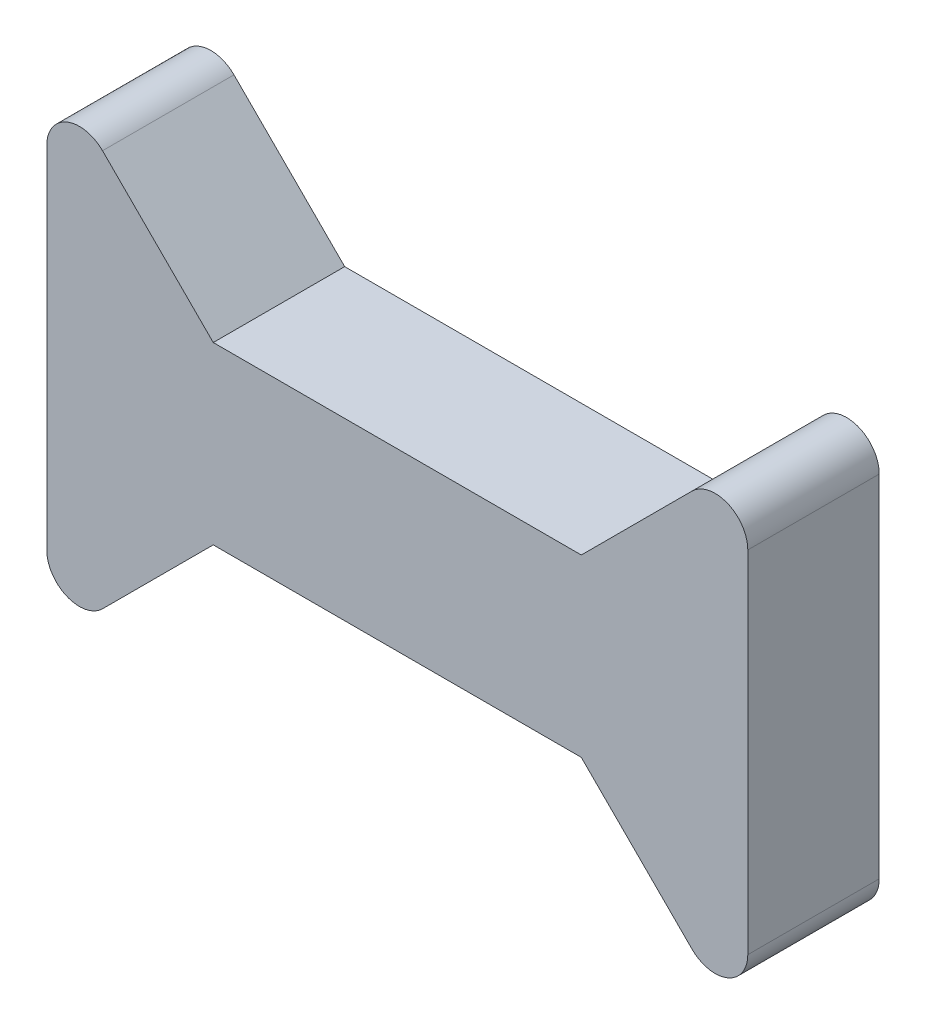
ISO-10303-21;
HEADER;
FILE_DESCRIPTION(('STEP AP214'),'2;1');
FILE_NAME('part.step','',(''),(''),'','','');
FILE_SCHEMA(('AUTOMOTIVE_DESIGN { 1 0 10303 214 1 1 1 1 }'));
ENDSEC;
DATA;
#1=APPLICATION_CONTEXT('core data for automotive mechanical design processes');
#2=APPLICATION_PROTOCOL_DEFINITION('international standard','automotive_design',2000,#1);
#3=PRODUCT_CONTEXT('',#1,'mechanical');
#4=PRODUCT('Part','Part','',(#3));
#5=PRODUCT_RELATED_PRODUCT_CATEGORY('part','',(#4));
#6=PRODUCT_DEFINITION_FORMATION('','',#4);
#7=PRODUCT_DEFINITION_CONTEXT('part definition',#1,'design');
#8=PRODUCT_DEFINITION('design','',#6,#7);
#9=PRODUCT_DEFINITION_SHAPE('','',#8);
#10=(LENGTH_UNIT() NAMED_UNIT(*) SI_UNIT(.MILLI.,.METRE.));
#11=(NAMED_UNIT(*) PLANE_ANGLE_UNIT() SI_UNIT($,.RADIAN.));
#12=(NAMED_UNIT(*) SI_UNIT($,.STERADIAN.) SOLID_ANGLE_UNIT());
#13=UNCERTAINTY_MEASURE_WITH_UNIT(LENGTH_MEASURE(1.E-05),#10,'distance_accuracy_value','');
#14=(GEOMETRIC_REPRESENTATION_CONTEXT(3) GLOBAL_UNCERTAINTY_ASSIGNED_CONTEXT((#13)) GLOBAL_UNIT_ASSIGNED_CONTEXT((#10,
#11,#12)) REPRESENTATION_CONTEXT('',''));
#15=CARTESIAN_POINT('',(0.,0.,0.));
#16=DIRECTION('',(0.,0.,1.));
#17=DIRECTION('',(1.,0.,0.));
#18=AXIS2_PLACEMENT_3D('',#15,#16,#17);
#19=CARTESIAN_POINT('',(10.5,5.,7.5));
#20=DIRECTION('',(0.707106781186549,-0.707106781186546,0.));
#21=DIRECTION('',(0.707106781186546,0.707106781186549,0.));
#22=AXIS2_PLACEMENT_3D('',#19,#20,#21);
#23=PLANE('',#22);
#24=DIRECTION('',(-0.707106781186546,-0.707106781186549,0.));
#25=VECTOR('',#24,1.);
#26=CARTESIAN_POINT('',(10.5,5.,0.));
#27=LINE('',#26,#25);
#28=CARTESIAN_POINT('',(16.8180194846605,11.3180194846605,0.));
#29=VERTEX_POINT('',#28);
#30=CARTESIAN_POINT('',(10.5,5.,0.));
#31=VERTEX_POINT('',#30);
#32=EDGE_CURVE('E159',#29,#31,#27,.T.);
#33=ORIENTED_EDGE('',*,*,#32,.T.);
#34=DIRECTION('',(0.,0.,-1.));
#35=VECTOR('',#34,1.);
#36=CARTESIAN_POINT('',(10.5,5.,7.5));
#37=LINE('',#36,#35);
#38=CARTESIAN_POINT('',(10.5,5.,7.5));
#39=VERTEX_POINT('',#38);
#40=EDGE_CURVE('E11',#39,#31,#37,.T.);
#41=ORIENTED_EDGE('',*,*,#40,.F.);
#42=DIRECTION('',(-0.707106781186546,-0.707106781186549,0.));
#43=VECTOR('',#42,1.);
#44=CARTESIAN_POINT('',(10.5,5.,7.5));
#45=LINE('',#44,#43);
#46=CARTESIAN_POINT('',(16.8180194846605,11.3180194846605,7.5));
#47=VERTEX_POINT('',#46);
#48=EDGE_CURVE('E181',#47,#39,#45,.T.);
#49=ORIENTED_EDGE('',*,*,#48,.F.);
#50=DIRECTION('',(0.,0.,-1.));
#51=VECTOR('',#50,1.);
#52=CARTESIAN_POINT('',(16.8180194846605,11.3180194846605,7.5));
#53=LINE('',#52,#51);
#54=EDGE_CURVE('E155',#47,#29,#53,.T.);
#55=ORIENTED_EDGE('',*,*,#54,.T.);
#56=EDGE_LOOP('',(#33,#41,#49,#55));
#57=FACE_BOUND('',#56,.T.);
#58=ADVANCED_FACE('F39',(#57),#23,.F.);
#59=CARTESIAN_POINT('',(-10.5,5.,7.5));
#60=DIRECTION('',(0.,-1.,0.));
#61=DIRECTION('',(0.,0.,-1.));
#62=AXIS2_PLACEMENT_3D('',#59,#60,#61);
#63=PLANE('',#62);
#64=DIRECTION('',(-1.,0.,0.));
#65=VECTOR('',#64,1.);
#66=CARTESIAN_POINT('',(-10.5,5.,0.));
#67=LINE('',#66,#65);
#68=CARTESIAN_POINT('',(-10.5,5.,0.));
#69=VERTEX_POINT('',#68);
#70=EDGE_CURVE('E162',#31,#69,#67,.T.);
#71=ORIENTED_EDGE('',*,*,#70,.T.);
#72=DIRECTION('',(0.,0.,-1.));
#73=VECTOR('',#72,1.);
#74=CARTESIAN_POINT('',(-10.5,5.,7.5));
#75=LINE('',#74,#73);
#76=CARTESIAN_POINT('',(-10.5,5.,7.5));
#77=VERTEX_POINT('',#76);
#78=EDGE_CURVE('E47',#77,#69,#75,.T.);
#79=ORIENTED_EDGE('',*,*,#78,.F.);
#80=DIRECTION('',(-1.,0.,0.));
#81=VECTOR('',#80,1.);
#82=CARTESIAN_POINT('',(-10.5,5.,7.5));
#83=LINE('',#82,#81);
#84=EDGE_CURVE('E110',#39,#77,#83,.T.);
#85=ORIENTED_EDGE('',*,*,#84,.F.);
#86=ORIENTED_EDGE('',*,*,#40,.T.);
#87=EDGE_LOOP('',(#71,#79,#85,#86));
#88=FACE_BOUND('',#87,.T.);
#89=ADVANCED_FACE('F259',(#88),#63,.F.);
#90=CARTESIAN_POINT('',(-10.5,5.,7.5));
#91=DIRECTION('',(-0.707106781186549,-0.707106781186546,0.));
#92=DIRECTION('',(0.707106781186546,-0.707106781186549,0.));
#93=AXIS2_PLACEMENT_3D('',#90,#91,#92);
#94=PLANE('',#93);
#95=DIRECTION('',(-0.707106781186546,0.707106781186549,0.));
#96=VECTOR('',#95,1.);
#97=CARTESIAN_POINT('',(-10.5,5.,0.));
#98=LINE('',#97,#96);
#99=CARTESIAN_POINT('',(-16.8180194846605,11.3180194846605,0.));
#100=VERTEX_POINT('',#99);
#101=EDGE_CURVE('E164',#69,#100,#98,.T.);
#102=ORIENTED_EDGE('',*,*,#101,.T.);
#103=DIRECTION('',(0.,0.,-1.));
#104=VECTOR('',#103,1.);
#105=CARTESIAN_POINT('',(-16.8180194846605,11.3180194846605,7.5));
#106=LINE('',#105,#104);
#107=CARTESIAN_POINT('',(-16.8180194846605,11.3180194846605,7.5));
#108=VERTEX_POINT('',#107);
#109=EDGE_CURVE('E200',#108,#100,#106,.T.);
#110=ORIENTED_EDGE('',*,*,#109,.F.);
#111=DIRECTION('',(-0.707106781186546,0.707106781186549,0.));
#112=VECTOR('',#111,1.);
#113=CARTESIAN_POINT('',(-10.5,5.,7.5));
#114=LINE('',#113,#112);
#115=EDGE_CURVE('E208',#77,#108,#114,.T.);
#116=ORIENTED_EDGE('',*,*,#115,.F.);
#117=ORIENTED_EDGE('',*,*,#78,.T.);
#118=EDGE_LOOP('',(#102,#110,#116,#117));
#119=FACE_BOUND('',#118,.T.);
#120=ADVANCED_FACE('F206',(#119),#94,.F.);
#121=CARTESIAN_POINT('',(-18.1360389693211,10.,7.5));
#122=DIRECTION('',(0.,0.,-1.));
#123=DIRECTION('',(-1.,0.,0.));
#124=AXIS2_PLACEMENT_3D('',#121,#122,#123);
#125=CYLINDRICAL_SURFACE('',#124,1.86396103067894);
#126=CARTESIAN_POINT('',(-18.1360389693211,10.,0.));
#127=DIRECTION('',(0.,0.,1.));
#128=DIRECTION('',(1.,0.,0.));
#129=AXIS2_PLACEMENT_3D('',#126,#127,#128);
#130=CIRCLE('',#129,1.86396103067894);
#131=CARTESIAN_POINT('',(-20.,9.99999999999999,0.));
#132=VERTEX_POINT('',#131);
#133=EDGE_CURVE('E166',#100,#132,#130,.T.);
#134=ORIENTED_EDGE('',*,*,#133,.T.);
#135=DIRECTION('',(0.,0.,-1.));
#136=VECTOR('',#135,1.);
#137=CARTESIAN_POINT('',(-20.,9.99999999999999,7.5));
#138=LINE('',#137,#136);
#139=CARTESIAN_POINT('',(-20.,9.99999999999999,7.5));
#140=VERTEX_POINT('',#139);
#141=EDGE_CURVE('E197',#140,#132,#138,.T.);
#142=ORIENTED_EDGE('',*,*,#141,.F.);
#143=CARTESIAN_POINT('',(-18.1360389693211,10.,7.5));
#144=DIRECTION('',(0.,0.,1.));
#145=DIRECTION('',(1.,0.,0.));
#146=AXIS2_PLACEMENT_3D('',#143,#144,#145);
#147=CIRCLE('',#146,1.86396103067894);
#148=EDGE_CURVE('E226',#108,#140,#147,.T.);
#149=ORIENTED_EDGE('',*,*,#148,.F.);
#150=ORIENTED_EDGE('',*,*,#109,.T.);
#151=EDGE_LOOP('',(#134,#142,#149,#150));
#152=FACE_BOUND('',#151,.T.);
#153=ADVANCED_FACE('F217',(#152),#125,.T.);
#154=CARTESIAN_POINT('',(-20.,9.99999999999999,7.5));
#155=DIRECTION('',(1.,0.,0.));
#156=DIRECTION('',(0.,1.,0.));
#157=AXIS2_PLACEMENT_3D('',#154,#155,#156);
#158=PLANE('',#157);
#159=DIRECTION('',(0.,-1.,0.));
#160=VECTOR('',#159,1.);
#161=CARTESIAN_POINT('',(-20.,9.99999999999999,0.));
#162=LINE('',#161,#160);
#163=CARTESIAN_POINT('',(-20.,-9.99999999999999,0.));
#164=VERTEX_POINT('',#163);
#165=EDGE_CURVE('E168',#132,#164,#162,.T.);
#166=ORIENTED_EDGE('',*,*,#165,.T.);
#167=DIRECTION('',(0.,0.,-1.));
#168=VECTOR('',#167,1.);
#169=CARTESIAN_POINT('',(-20.,-9.99999999999999,7.5));
#170=LINE('',#169,#168);
#171=CARTESIAN_POINT('',(-20.,-9.99999999999999,7.5));
#172=VERTEX_POINT('',#171);
#173=EDGE_CURVE('E194',#172,#164,#170,.T.);
#174=ORIENTED_EDGE('',*,*,#173,.F.);
#175=DIRECTION('',(0.,-1.,0.));
#176=VECTOR('',#175,1.);
#177=CARTESIAN_POINT('',(-20.,9.99999999999999,7.5));
#178=LINE('',#177,#176);
#179=EDGE_CURVE('E223',#140,#172,#178,.T.);
#180=ORIENTED_EDGE('',*,*,#179,.F.);
#181=ORIENTED_EDGE('',*,*,#141,.T.);
#182=EDGE_LOOP('',(#166,#174,#180,#181));
#183=FACE_BOUND('',#182,.T.);
#184=ADVANCED_FACE('F221',(#183),#158,.F.);
#185=CARTESIAN_POINT('',(-18.1360389693211,-10.,7.5));
#186=DIRECTION('',(0.,0.,-1.));
#187=DIRECTION('',(-1.,0.,0.));
#188=AXIS2_PLACEMENT_3D('',#185,#186,#187);
#189=CYLINDRICAL_SURFACE('',#188,1.86396103067894);
#190=CARTESIAN_POINT('',(-18.1360389693211,-10.,0.));
#191=DIRECTION('',(0.,0.,1.));
#192=DIRECTION('',(-1.,0.,0.));
#193=AXIS2_PLACEMENT_3D('',#190,#191,#192);
#194=CIRCLE('',#193,1.86396103067894);
#195=CARTESIAN_POINT('',(-16.8180194846605,-11.3180194846605,0.));
#196=VERTEX_POINT('',#195);
#197=EDGE_CURVE('E170',#164,#196,#194,.T.);
#198=ORIENTED_EDGE('',*,*,#197,.T.);
#199=DIRECTION('',(0.,0.,-1.));
#200=VECTOR('',#199,1.);
#201=CARTESIAN_POINT('',(-16.8180194846605,-11.3180194846605,7.5));
#202=LINE('',#201,#200);
#203=CARTESIAN_POINT('',(-16.8180194846605,-11.3180194846605,7.5));
#204=VERTEX_POINT('',#203);
#205=EDGE_CURVE('E191',#204,#196,#202,.T.);
#206=ORIENTED_EDGE('',*,*,#205,.F.);
#207=CARTESIAN_POINT('',(-18.1360389693211,-10.,7.5));
#208=DIRECTION('',(0.,0.,1.));
#209=DIRECTION('',(-1.,0.,0.));
#210=AXIS2_PLACEMENT_3D('',#207,#208,#209);
#211=CIRCLE('',#210,1.86396103067894);
#212=EDGE_CURVE('E225',#172,#204,#211,.T.);
#213=ORIENTED_EDGE('',*,*,#212,.F.);
#214=ORIENTED_EDGE('',*,*,#173,.T.);
#215=EDGE_LOOP('',(#198,#206,#213,#214));
#216=FACE_BOUND('',#215,.T.);
#217=ADVANCED_FACE('F272',(#216),#189,.T.);
#218=CARTESIAN_POINT('',(-10.5,-5.,7.5));
#219=DIRECTION('',(-0.707106781186549,0.707106781186546,0.));
#220=DIRECTION('',(-0.707106781186546,-0.707106781186549,0.));
#221=AXIS2_PLACEMENT_3D('',#218,#219,#220);
#222=PLANE('',#221);
#223=DIRECTION('',(0.707106781186546,0.707106781186549,0.));
#224=VECTOR('',#223,1.);
#225=CARTESIAN_POINT('',(-10.5,-5.,0.));
#226=LINE('',#225,#224);
#227=CARTESIAN_POINT('',(-10.5,-5.,0.));
#228=VERTEX_POINT('',#227);
#229=EDGE_CURVE('E172',#196,#228,#226,.T.);
#230=ORIENTED_EDGE('',*,*,#229,.T.);
#231=DIRECTION('',(0.,0.,-1.));
#232=VECTOR('',#231,1.);
#233=CARTESIAN_POINT('',(-10.5,-5.,7.5));
#234=LINE('',#233,#232);
#235=CARTESIAN_POINT('',(-10.5,-5.,7.5));
#236=VERTEX_POINT('',#235);
#237=EDGE_CURVE('E188',#236,#228,#234,.T.);
#238=ORIENTED_EDGE('',*,*,#237,.F.);
#239=DIRECTION('',(0.707106781186546,0.707106781186549,0.));
#240=VECTOR('',#239,1.);
#241=CARTESIAN_POINT('',(-10.5,-5.,7.5));
#242=LINE('',#241,#240);
#243=EDGE_CURVE('E228',#204,#236,#242,.T.);
#244=ORIENTED_EDGE('',*,*,#243,.F.);
#245=ORIENTED_EDGE('',*,*,#205,.T.);
#246=EDGE_LOOP('',(#230,#238,#244,#245));
#247=FACE_BOUND('',#246,.T.);
#248=ADVANCED_FACE('F275',(#247),#222,.F.);
#249=CARTESIAN_POINT('',(-10.5,-5.,7.5));
#250=DIRECTION('',(0.,1.,0.));
#251=DIRECTION('',(0.,0.,1.));
#252=AXIS2_PLACEMENT_3D('',#249,#250,#251);
#253=PLANE('',#252);
#254=DIRECTION('',(1.,0.,0.));
#255=VECTOR('',#254,1.);
#256=CARTESIAN_POINT('',(-10.5,-5.,0.));
#257=LINE('',#256,#255);
#258=CARTESIAN_POINT('',(10.5,-5.,0.));
#259=VERTEX_POINT('',#258);
#260=EDGE_CURVE('E174',#228,#259,#257,.T.);
#261=ORIENTED_EDGE('',*,*,#260,.T.);
#262=DIRECTION('',(0.,0.,-1.));
#263=VECTOR('',#262,1.);
#264=CARTESIAN_POINT('',(10.5,-5.,7.5));
#265=LINE('',#264,#263);
#266=CARTESIAN_POINT('',(10.5,-5.,7.5));
#267=VERTEX_POINT('',#266);
#268=EDGE_CURVE('E185',#267,#259,#265,.T.);
#269=ORIENTED_EDGE('',*,*,#268,.F.);
#270=DIRECTION('',(1.,0.,0.));
#271=VECTOR('',#270,1.);
#272=CARTESIAN_POINT('',(-10.5,-5.,7.5));
#273=LINE('',#272,#271);
#274=EDGE_CURVE('E234',#236,#267,#273,.T.);
#275=ORIENTED_EDGE('',*,*,#274,.F.);
#276=ORIENTED_EDGE('',*,*,#237,.T.);
#277=EDGE_LOOP('',(#261,#269,#275,#276));
#278=FACE_BOUND('',#277,.T.);
#279=ADVANCED_FACE('F240',(#278),#253,.F.);
#280=CARTESIAN_POINT('',(10.5,-5.,7.5));
#281=DIRECTION('',(0.707106781186549,0.707106781186546,0.));
#282=DIRECTION('',(-0.707106781186546,0.707106781186549,0.));
#283=AXIS2_PLACEMENT_3D('',#280,#281,#282);
#284=PLANE('',#283);
#285=DIRECTION('',(0.707106781186546,-0.707106781186549,0.));
#286=VECTOR('',#285,1.);
#287=CARTESIAN_POINT('',(10.5,-5.,0.));
#288=LINE('',#287,#286);
#289=CARTESIAN_POINT('',(16.8180194846605,-11.3180194846605,0.));
#290=VERTEX_POINT('',#289);
#291=EDGE_CURVE('E176',#259,#290,#288,.T.);
#292=ORIENTED_EDGE('',*,*,#291,.T.);
#293=DIRECTION('',(0.,0.,-1.));
#294=VECTOR('',#293,1.);
#295=CARTESIAN_POINT('',(16.8180194846605,-11.3180194846605,7.5));
#296=LINE('',#295,#294);
#297=CARTESIAN_POINT('',(16.8180194846605,-11.3180194846605,7.5));
#298=VERTEX_POINT('',#297);
#299=EDGE_CURVE('E150',#298,#290,#296,.T.);
#300=ORIENTED_EDGE('',*,*,#299,.F.);
#301=DIRECTION('',(0.707106781186546,-0.707106781186549,0.));
#302=VECTOR('',#301,1.);
#303=CARTESIAN_POINT('',(10.5,-5.,7.5));
#304=LINE('',#303,#302);
#305=EDGE_CURVE('E141',#267,#298,#304,.T.);
#306=ORIENTED_EDGE('',*,*,#305,.F.);
#307=ORIENTED_EDGE('',*,*,#268,.T.);
#308=EDGE_LOOP('',(#292,#300,#306,#307));
#309=FACE_BOUND('',#308,.T.);
#310=ADVANCED_FACE('F244',(#309),#284,.F.);
#311=CARTESIAN_POINT('',(18.1360389693211,-10.,7.5));
#312=DIRECTION('',(0.,0.,-1.));
#313=DIRECTION('',(-1.,0.,0.));
#314=AXIS2_PLACEMENT_3D('',#311,#312,#313);
#315=CYLINDRICAL_SURFACE('',#314,1.86396103067894);
#316=CARTESIAN_POINT('',(18.1360389693211,-10.,0.));
#317=DIRECTION('',(0.,0.,1.));
#318=DIRECTION('',(1.,0.,0.));
#319=AXIS2_PLACEMENT_3D('',#316,#317,#318);
#320=CIRCLE('',#319,1.86396103067894);
#321=CARTESIAN_POINT('',(20.,-10.,0.));
#322=VERTEX_POINT('',#321);
#323=EDGE_CURVE('E149',#290,#322,#320,.T.);
#324=ORIENTED_EDGE('',*,*,#323,.T.);
#325=DIRECTION('',(0.,0.,-1.));
#326=VECTOR('',#325,1.);
#327=CARTESIAN_POINT('',(20.,-10.,7.5));
#328=LINE('',#327,#326);
#329=CARTESIAN_POINT('',(20.,-10.,7.5));
#330=VERTEX_POINT('',#329);
#331=EDGE_CURVE('E146',#330,#322,#328,.T.);
#332=ORIENTED_EDGE('',*,*,#331,.F.);
#333=CARTESIAN_POINT('',(18.1360389693211,-10.,7.5));
#334=DIRECTION('',(0.,0.,1.));
#335=DIRECTION('',(1.,0.,0.));
#336=AXIS2_PLACEMENT_3D('',#333,#334,#335);
#337=CIRCLE('',#336,1.86396103067894);
#338=EDGE_CURVE('E135',#298,#330,#337,.T.);
#339=ORIENTED_EDGE('',*,*,#338,.F.);
#340=ORIENTED_EDGE('',*,*,#299,.T.);
#341=EDGE_LOOP('',(#324,#332,#339,#340));
#342=FACE_BOUND('',#341,.T.);
#343=ADVANCED_FACE('F147',(#342),#315,.T.);
#344=CARTESIAN_POINT('',(20.,10.,7.5));
#345=DIRECTION('',(-1.,0.,0.));
#346=DIRECTION('',(0.,0.,1.));
#347=AXIS2_PLACEMENT_3D('',#344,#345,#346);
#348=PLANE('',#347);
#349=DIRECTION('',(0.,1.,0.));
#350=VECTOR('',#349,1.);
#351=CARTESIAN_POINT('',(20.,10.,0.));
#352=LINE('',#351,#350);
#353=CARTESIAN_POINT('',(20.,10.,0.));
#354=VERTEX_POINT('',#353);
#355=EDGE_CURVE('E96',#322,#354,#352,.T.);
#356=ORIENTED_EDGE('',*,*,#355,.T.);
#357=DIRECTION('',(0.,0.,-1.));
#358=VECTOR('',#357,1.);
#359=CARTESIAN_POINT('',(20.,10.,7.5));
#360=LINE('',#359,#358);
#361=CARTESIAN_POINT('',(20.,10.,7.5));
#362=VERTEX_POINT('',#361);
#363=EDGE_CURVE('E151',#362,#354,#360,.T.);
#364=ORIENTED_EDGE('',*,*,#363,.F.);
#365=DIRECTION('',(0.,1.,0.));
#366=VECTOR('',#365,1.);
#367=CARTESIAN_POINT('',(20.,10.,7.5));
#368=LINE('',#367,#366);
#369=EDGE_CURVE('E139',#330,#362,#368,.T.);
#370=ORIENTED_EDGE('',*,*,#369,.F.);
#371=ORIENTED_EDGE('',*,*,#331,.T.);
#372=EDGE_LOOP('',(#356,#364,#370,#371));
#373=FACE_BOUND('',#372,.T.);
#374=ADVANCED_FACE('F153',(#373),#348,.F.);
#375=CARTESIAN_POINT('',(18.1360389693211,10.,7.5));
#376=DIRECTION('',(0.,0.,-1.));
#377=DIRECTION('',(-1.,0.,0.));
#378=AXIS2_PLACEMENT_3D('',#375,#376,#377);
#379=CYLINDRICAL_SURFACE('',#378,1.86396103067894);
#380=CARTESIAN_POINT('',(18.1360389693211,10.,0.));
#381=DIRECTION('',(0.,0.,1.));
#382=DIRECTION('',(-1.,0.,0.));
#383=AXIS2_PLACEMENT_3D('',#380,#381,#382);
#384=CIRCLE('',#383,1.86396103067894);
#385=EDGE_CURVE('E102',#354,#29,#384,.T.);
#386=ORIENTED_EDGE('',*,*,#385,.T.);
#387=ORIENTED_EDGE('',*,*,#54,.F.);
#388=CARTESIAN_POINT('',(18.1360389693211,10.,7.5));
#389=DIRECTION('',(0.,0.,1.));
#390=DIRECTION('',(-1.,0.,0.));
#391=AXIS2_PLACEMENT_3D('',#388,#389,#390);
#392=CIRCLE('',#391,1.86396103067894);
#393=EDGE_CURVE('E55',#362,#47,#392,.T.);
#394=ORIENTED_EDGE('',*,*,#393,.F.);
#395=ORIENTED_EDGE('',*,*,#363,.T.);
#396=EDGE_LOOP('',(#386,#387,#394,#395));
#397=FACE_BOUND('',#396,.T.);
#398=ADVANCED_FACE('F248',(#397),#379,.T.);
#399=CARTESIAN_POINT('',(18.1360389693211,10.,7.5));
#400=DIRECTION('',(0.,0.,-1.));
#401=DIRECTION('',(-1.,0.,0.));
#402=AXIS2_PLACEMENT_3D('',#399,#400,#401);
#403=PLANE('',#402);
#404=ORIENTED_EDGE('',*,*,#48,.T.);
#405=ORIENTED_EDGE('',*,*,#84,.T.);
#406=ORIENTED_EDGE('',*,*,#115,.T.);
#407=ORIENTED_EDGE('',*,*,#148,.T.);
#408=ORIENTED_EDGE('',*,*,#179,.T.);
#409=ORIENTED_EDGE('',*,*,#212,.T.);
#410=ORIENTED_EDGE('',*,*,#243,.T.);
#411=ORIENTED_EDGE('',*,*,#274,.T.);
#412=ORIENTED_EDGE('',*,*,#305,.T.);
#413=ORIENTED_EDGE('',*,*,#338,.T.);
#414=ORIENTED_EDGE('',*,*,#369,.T.);
#415=ORIENTED_EDGE('',*,*,#393,.T.);
#416=EDGE_LOOP('',(#404,#405,#406,#407,#408,#409,#410,#411,#412,#413,#414,#415));
#417=FACE_BOUND('',#416,.T.);
#418=ADVANCED_FACE('F137',(#417),#403,.F.);
#419=CARTESIAN_POINT('',(18.1360389693211,10.,0.));
#420=DIRECTION('',(0.,0.,-1.));
#421=DIRECTION('',(-1.,0.,0.));
#422=AXIS2_PLACEMENT_3D('',#419,#420,#421);
#423=PLANE('',#422);
#424=ORIENTED_EDGE('',*,*,#32,.F.);
#425=ORIENTED_EDGE('',*,*,#385,.F.);
#426=ORIENTED_EDGE('',*,*,#355,.F.);
#427=ORIENTED_EDGE('',*,*,#323,.F.);
#428=ORIENTED_EDGE('',*,*,#291,.F.);
#429=ORIENTED_EDGE('',*,*,#260,.F.);
#430=ORIENTED_EDGE('',*,*,#229,.F.);
#431=ORIENTED_EDGE('',*,*,#197,.F.);
#432=ORIENTED_EDGE('',*,*,#165,.F.);
#433=ORIENTED_EDGE('',*,*,#133,.F.);
#434=ORIENTED_EDGE('',*,*,#101,.F.);
#435=ORIENTED_EDGE('',*,*,#70,.F.);
#436=EDGE_LOOP('',(#424,#425,#426,#427,#428,#429,#430,#431,#432,#433,#434,#435));
#437=FACE_BOUND('',#436,.T.);
#438=ADVANCED_FACE('F212',(#437),#423,.T.);
#439=CLOSED_SHELL('',(#58,#89,#120,#153,#184,#217,#248,#279,#310,#343,#374,#398,#418,#438));
#440=MANIFOLD_SOLID_BREP('B2',#439);
#441=ADVANCED_BREP_SHAPE_REPRESENTATION('',(#18,#440),#14);
#442=SHAPE_DEFINITION_REPRESENTATION(#9,#441);
ENDSEC;
END-ISO-10303-21;
